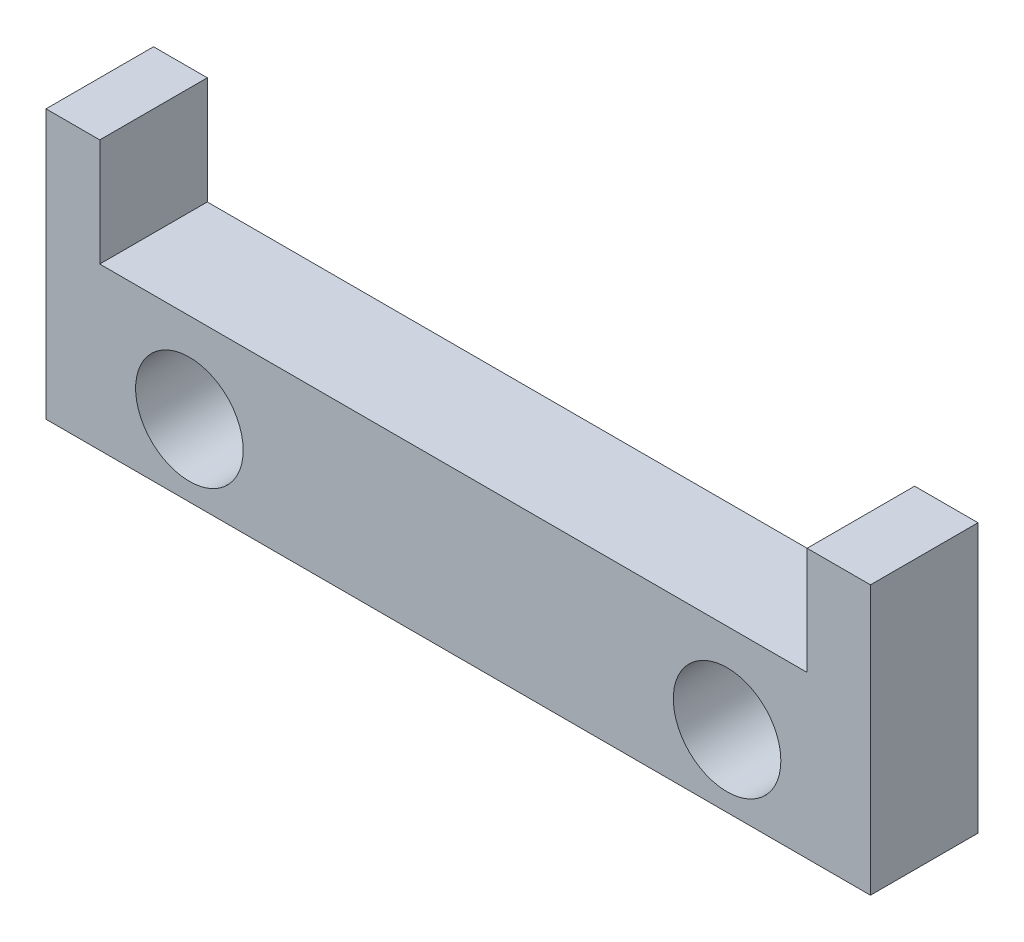
ISO-10303-21;
HEADER;
FILE_DESCRIPTION(('STEP AP214'),'2;1');
FILE_NAME('part.step','',(''),(''),'','','');
FILE_SCHEMA(('AUTOMOTIVE_DESIGN { 1 0 10303 214 1 1 1 1 }'));
ENDSEC;
DATA;
#1=APPLICATION_CONTEXT('core data for automotive mechanical design processes');
#2=APPLICATION_PROTOCOL_DEFINITION('international standard','automotive_design',2000,#1);
#3=PRODUCT_CONTEXT('',#1,'mechanical');
#4=PRODUCT('Part','Part','',(#3));
#5=PRODUCT_RELATED_PRODUCT_CATEGORY('part','',(#4));
#6=PRODUCT_DEFINITION_FORMATION('','',#4);
#7=PRODUCT_DEFINITION_CONTEXT('part definition',#1,'design');
#8=PRODUCT_DEFINITION('design','',#6,#7);
#9=PRODUCT_DEFINITION_SHAPE('','',#8);
#10=(LENGTH_UNIT() NAMED_UNIT(*) SI_UNIT(.MILLI.,.METRE.));
#11=(NAMED_UNIT(*) PLANE_ANGLE_UNIT() SI_UNIT($,.RADIAN.));
#12=(NAMED_UNIT(*) SI_UNIT($,.STERADIAN.) SOLID_ANGLE_UNIT());
#13=UNCERTAINTY_MEASURE_WITH_UNIT(LENGTH_MEASURE(1.E-05),#10,'distance_accuracy_value','');
#14=(GEOMETRIC_REPRESENTATION_CONTEXT(3) GLOBAL_UNCERTAINTY_ASSIGNED_CONTEXT((#13)) GLOBAL_UNIT_ASSIGNED_CONTEXT((#10,
#11,#12)) REPRESENTATION_CONTEXT('',''));
#15=CARTESIAN_POINT('',(0.,0.,0.));
#16=DIRECTION('',(0.,0.,1.));
#17=DIRECTION('',(1.,0.,0.));
#18=AXIS2_PLACEMENT_3D('',#15,#16,#17);
#19=CARTESIAN_POINT('',(0.,0.,6.));
#20=DIRECTION('',(0.,0.,1.));
#21=DIRECTION('',(1.,0.,0.));
#22=AXIS2_PLACEMENT_3D('',#19,#20,#21);
#23=PLANE('',#22);
#24=CARTESIAN_POINT('',(-15.,4.,6.));
#25=DIRECTION('',(0.,0.,1.));
#26=DIRECTION('',(1.,0.,0.));
#27=AXIS2_PLACEMENT_3D('',#24,#25,#26);
#28=CIRCLE('',#27,3.);
#29=CARTESIAN_POINT('',(-12.,4.,6.));
#30=VERTEX_POINT('',#29);
#31=EDGE_CURVE('E134',#30,#30,#28,.T.);
#32=ORIENTED_EDGE('',*,*,#31,.F.);
#33=EDGE_LOOP('',(#32));
#34=FACE_BOUND('',#33,.T.);
#35=DIRECTION('',(0.,-1.,0.));
#36=VECTOR('',#35,1.);
#37=CARTESIAN_POINT('',(-23.,15.,6.));
#38=LINE('',#37,#36);
#39=CARTESIAN_POINT('',(-23.,15.,6.));
#40=VERTEX_POINT('',#39);
#41=CARTESIAN_POINT('',(-23.,0.,6.));
#42=VERTEX_POINT('',#41);
#43=EDGE_CURVE('E145',#40,#42,#38,.T.);
#44=ORIENTED_EDGE('',*,*,#43,.T.);
#45=DIRECTION('',(1.,0.,0.));
#46=VECTOR('',#45,1.);
#47=CARTESIAN_POINT('',(-23.,0.,6.));
#48=LINE('',#47,#46);
#49=CARTESIAN_POINT('',(23.,0.,6.));
#50=VERTEX_POINT('',#49);
#51=EDGE_CURVE('E93',#42,#50,#48,.T.);
#52=ORIENTED_EDGE('',*,*,#51,.T.);
#53=DIRECTION('',(0.,1.,0.));
#54=VECTOR('',#53,1.);
#55=CARTESIAN_POINT('',(23.,0.,6.));
#56=LINE('',#55,#54);
#57=CARTESIAN_POINT('',(23.,15.,6.));
#58=VERTEX_POINT('',#57);
#59=EDGE_CURVE('E160',#50,#58,#56,.T.);
#60=ORIENTED_EDGE('',*,*,#59,.T.);
#61=DIRECTION('',(-1.,0.,0.));
#62=VECTOR('',#61,1.);
#63=CARTESIAN_POINT('',(19.4646030716631,15.,6.));
#64=LINE('',#63,#62);
#65=CARTESIAN_POINT('',(19.4646030716631,15.,6.));
#66=VERTEX_POINT('',#65);
#67=EDGE_CURVE('E173',#58,#66,#64,.T.);
#68=ORIENTED_EDGE('',*,*,#67,.T.);
#69=DIRECTION('',(0.,-1.,0.));
#70=VECTOR('',#69,1.);
#71=CARTESIAN_POINT('',(19.4646030716631,9.,6.));
#72=LINE('',#71,#70);
#73=CARTESIAN_POINT('',(19.4646030716631,9.,6.));
#74=VERTEX_POINT('',#73);
#75=EDGE_CURVE('E112',#66,#74,#72,.T.);
#76=ORIENTED_EDGE('',*,*,#75,.T.);
#77=DIRECTION('',(-1.,0.,0.));
#78=VECTOR('',#77,1.);
#79=CARTESIAN_POINT('',(-20.,9.,6.));
#80=LINE('',#79,#78);
#81=CARTESIAN_POINT('',(-20.,9.,6.));
#82=VERTEX_POINT('',#81);
#83=EDGE_CURVE('E106',#74,#82,#80,.T.);
#84=ORIENTED_EDGE('',*,*,#83,.T.);
#85=DIRECTION('',(0.,1.,0.));
#86=VECTOR('',#85,1.);
#87=CARTESIAN_POINT('',(-20.,15.,6.));
#88=LINE('',#87,#86);
#89=CARTESIAN_POINT('',(-20.,15.,6.));
#90=VERTEX_POINT('',#89);
#91=EDGE_CURVE('E110',#82,#90,#88,.T.);
#92=ORIENTED_EDGE('',*,*,#91,.T.);
#93=DIRECTION('',(-1.,0.,0.));
#94=VECTOR('',#93,1.);
#95=CARTESIAN_POINT('',(-23.,15.,6.));
#96=LINE('',#95,#94);
#97=EDGE_CURVE('E50',#90,#40,#96,.T.);
#98=ORIENTED_EDGE('',*,*,#97,.T.);
#99=EDGE_LOOP('',(#44,#52,#60,#68,#76,#84,#92,#98));
#100=FACE_BOUND('',#99,.T.);
#101=CARTESIAN_POINT('',(15.,4.,6.));
#102=DIRECTION('',(0.,0.,1.));
#103=DIRECTION('',(1.,0.,0.));
#104=AXIS2_PLACEMENT_3D('',#101,#102,#103);
#105=CIRCLE('',#104,3.);
#106=CARTESIAN_POINT('',(18.,4.,6.));
#107=VERTEX_POINT('',#106);
#108=EDGE_CURVE('E182',#107,#107,#105,.T.);
#109=ORIENTED_EDGE('',*,*,#108,.F.);
#110=EDGE_LOOP('',(#109));
#111=FACE_BOUND('',#110,.T.);
#112=ADVANCED_FACE('F33',(#34,#100,#111),#23,.T.);
#113=CARTESIAN_POINT('',(0.,0.,0.));
#114=DIRECTION('',(0.,0.,1.));
#115=DIRECTION('',(1.,0.,0.));
#116=AXIS2_PLACEMENT_3D('',#113,#114,#115);
#117=PLANE('',#116);
#118=DIRECTION('',(0.,-1.,0.));
#119=VECTOR('',#118,1.);
#120=CARTESIAN_POINT('',(-23.,15.,0.));
#121=LINE('',#120,#119);
#122=CARTESIAN_POINT('',(-23.,15.,0.));
#123=VERTEX_POINT('',#122);
#124=CARTESIAN_POINT('',(-23.,0.,0.));
#125=VERTEX_POINT('',#124);
#126=EDGE_CURVE('E130',#123,#125,#121,.T.);
#127=ORIENTED_EDGE('',*,*,#126,.F.);
#128=DIRECTION('',(-1.,0.,0.));
#129=VECTOR('',#128,1.);
#130=CARTESIAN_POINT('',(-23.,15.,0.));
#131=LINE('',#130,#129);
#132=CARTESIAN_POINT('',(-20.,15.,0.));
#133=VERTEX_POINT('',#132);
#134=EDGE_CURVE('E85',#133,#123,#131,.T.);
#135=ORIENTED_EDGE('',*,*,#134,.F.);
#136=DIRECTION('',(0.,1.,0.));
#137=VECTOR('',#136,1.);
#138=CARTESIAN_POINT('',(-20.,15.,0.));
#139=LINE('',#138,#137);
#140=CARTESIAN_POINT('',(-20.,9.,0.));
#141=VERTEX_POINT('',#140);
#142=EDGE_CURVE('E79',#141,#133,#139,.T.);
#143=ORIENTED_EDGE('',*,*,#142,.F.);
#144=DIRECTION('',(-1.,0.,0.));
#145=VECTOR('',#144,1.);
#146=CARTESIAN_POINT('',(-20.,9.,0.));
#147=LINE('',#146,#145);
#148=CARTESIAN_POINT('',(19.4646030716631,9.,0.));
#149=VERTEX_POINT('',#148);
#150=EDGE_CURVE('E120',#149,#141,#147,.T.);
#151=ORIENTED_EDGE('',*,*,#150,.F.);
#152=DIRECTION('',(0.,-1.,0.));
#153=VECTOR('',#152,1.);
#154=CARTESIAN_POINT('',(19.4646030716631,9.,0.));
#155=LINE('',#154,#153);
#156=CARTESIAN_POINT('',(19.4646030716631,15.,0.));
#157=VERTEX_POINT('',#156);
#158=EDGE_CURVE('E140',#157,#149,#155,.T.);
#159=ORIENTED_EDGE('',*,*,#158,.F.);
#160=DIRECTION('',(-1.,0.,0.));
#161=VECTOR('',#160,1.);
#162=CARTESIAN_POINT('',(19.4646030716631,15.,0.));
#163=LINE('',#162,#161);
#164=CARTESIAN_POINT('',(23.,15.,0.));
#165=VERTEX_POINT('',#164);
#166=EDGE_CURVE('E138',#165,#157,#163,.T.);
#167=ORIENTED_EDGE('',*,*,#166,.F.);
#168=DIRECTION('',(0.,1.,0.));
#169=VECTOR('',#168,1.);
#170=CARTESIAN_POINT('',(23.,0.,0.));
#171=LINE('',#170,#169);
#172=CARTESIAN_POINT('',(23.,0.,0.));
#173=VERTEX_POINT('',#172);
#174=EDGE_CURVE('E136',#173,#165,#171,.T.);
#175=ORIENTED_EDGE('',*,*,#174,.F.);
#176=DIRECTION('',(1.,0.,0.));
#177=VECTOR('',#176,1.);
#178=CARTESIAN_POINT('',(-23.,0.,0.));
#179=LINE('',#178,#177);
#180=EDGE_CURVE('E133',#125,#173,#179,.T.);
#181=ORIENTED_EDGE('',*,*,#180,.F.);
#182=EDGE_LOOP('',(#127,#135,#143,#151,#159,#167,#175,#181));
#183=FACE_BOUND('',#182,.T.);
#184=CARTESIAN_POINT('',(-15.,4.,0.));
#185=DIRECTION('',(0.,0.,1.));
#186=DIRECTION('',(1.,0.,0.));
#187=AXIS2_PLACEMENT_3D('',#184,#185,#186);
#188=CIRCLE('',#187,3.);
#189=CARTESIAN_POINT('',(-12.,4.,0.));
#190=VERTEX_POINT('',#189);
#191=EDGE_CURVE('E179',#190,#190,#188,.T.);
#192=ORIENTED_EDGE('',*,*,#191,.T.);
#193=EDGE_LOOP('',(#192));
#194=FACE_BOUND('',#193,.T.);
#195=CARTESIAN_POINT('',(15.,4.,0.));
#196=DIRECTION('',(0.,0.,1.));
#197=DIRECTION('',(1.,0.,0.));
#198=AXIS2_PLACEMENT_3D('',#195,#196,#197);
#199=CIRCLE('',#198,3.);
#200=CARTESIAN_POINT('',(18.,4.,0.));
#201=VERTEX_POINT('',#200);
#202=EDGE_CURVE('E185',#201,#201,#199,.T.);
#203=ORIENTED_EDGE('',*,*,#202,.T.);
#204=EDGE_LOOP('',(#203));
#205=FACE_BOUND('',#204,.T.);
#206=ADVANCED_FACE('F164',(#183,#194,#205),#117,.F.);
#207=CARTESIAN_POINT('',(-23.,15.,6.));
#208=DIRECTION('',(1.,0.,0.));
#209=DIRECTION('',(0.,0.,-1.));
#210=AXIS2_PLACEMENT_3D('',#207,#208,#209);
#211=PLANE('',#210);
#212=ORIENTED_EDGE('',*,*,#126,.T.);
#213=DIRECTION('',(0.,0.,-1.));
#214=VECTOR('',#213,1.);
#215=CARTESIAN_POINT('',(-23.,0.,6.));
#216=LINE('',#215,#214);
#217=EDGE_CURVE('E11',#42,#125,#216,.T.);
#218=ORIENTED_EDGE('',*,*,#217,.F.);
#219=ORIENTED_EDGE('',*,*,#43,.F.);
#220=DIRECTION('',(0.,0.,-1.));
#221=VECTOR('',#220,1.);
#222=CARTESIAN_POINT('',(-23.,15.,6.));
#223=LINE('',#222,#221);
#224=EDGE_CURVE('E126',#40,#123,#223,.T.);
#225=ORIENTED_EDGE('',*,*,#224,.T.);
#226=EDGE_LOOP('',(#212,#218,#219,#225));
#227=FACE_BOUND('',#226,.T.);
#228=ADVANCED_FACE('F35',(#227),#211,.F.);
#229=CARTESIAN_POINT('',(-23.,0.,6.));
#230=DIRECTION('',(0.,1.,0.));
#231=DIRECTION('',(-1.,0.,0.));
#232=AXIS2_PLACEMENT_3D('',#229,#230,#231);
#233=PLANE('',#232);
#234=ORIENTED_EDGE('',*,*,#180,.T.);
#235=DIRECTION('',(0.,0.,-1.));
#236=VECTOR('',#235,1.);
#237=CARTESIAN_POINT('',(23.,0.,6.));
#238=LINE('',#237,#236);
#239=EDGE_CURVE('E42',#50,#173,#238,.T.);
#240=ORIENTED_EDGE('',*,*,#239,.F.);
#241=ORIENTED_EDGE('',*,*,#51,.F.);
#242=ORIENTED_EDGE('',*,*,#217,.T.);
#243=EDGE_LOOP('',(#234,#240,#241,#242));
#244=FACE_BOUND('',#243,.T.);
#245=ADVANCED_FACE('F217',(#244),#233,.F.);
#246=CARTESIAN_POINT('',(23.,0.,6.));
#247=DIRECTION('',(-1.,0.,0.));
#248=DIRECTION('',(0.,0.,1.));
#249=AXIS2_PLACEMENT_3D('',#246,#247,#248);
#250=PLANE('',#249);
#251=ORIENTED_EDGE('',*,*,#174,.T.);
#252=DIRECTION('',(0.,0.,-1.));
#253=VECTOR('',#252,1.);
#254=CARTESIAN_POINT('',(23.,15.,6.));
#255=LINE('',#254,#253);
#256=EDGE_CURVE('E152',#58,#165,#255,.T.);
#257=ORIENTED_EDGE('',*,*,#256,.F.);
#258=ORIENTED_EDGE('',*,*,#59,.F.);
#259=ORIENTED_EDGE('',*,*,#239,.T.);
#260=EDGE_LOOP('',(#251,#257,#258,#259));
#261=FACE_BOUND('',#260,.T.);
#262=ADVANCED_FACE('F158',(#261),#250,.F.);
#263=CARTESIAN_POINT('',(19.4646030716631,15.,6.));
#264=DIRECTION('',(0.,-1.,0.));
#265=DIRECTION('',(0.,0.,-1.));
#266=AXIS2_PLACEMENT_3D('',#263,#264,#265);
#267=PLANE('',#266);
#268=ORIENTED_EDGE('',*,*,#166,.T.);
#269=DIRECTION('',(0.,0.,-1.));
#270=VECTOR('',#269,1.);
#271=CARTESIAN_POINT('',(19.4646030716631,15.,6.));
#272=LINE('',#271,#270);
#273=EDGE_CURVE('E149',#66,#157,#272,.T.);
#274=ORIENTED_EDGE('',*,*,#273,.F.);
#275=ORIENTED_EDGE('',*,*,#67,.F.);
#276=ORIENTED_EDGE('',*,*,#256,.T.);
#277=EDGE_LOOP('',(#268,#274,#275,#276));
#278=FACE_BOUND('',#277,.T.);
#279=ADVANCED_FACE('F169',(#278),#267,.F.);
#280=CARTESIAN_POINT('',(19.4646030716631,9.,6.));
#281=DIRECTION('',(1.,0.,0.));
#282=DIRECTION('',(0.,0.,-1.));
#283=AXIS2_PLACEMENT_3D('',#280,#281,#282);
#284=PLANE('',#283);
#285=ORIENTED_EDGE('',*,*,#158,.T.);
#286=DIRECTION('',(0.,0.,-1.));
#287=VECTOR('',#286,1.);
#288=CARTESIAN_POINT('',(19.4646030716631,9.,6.));
#289=LINE('',#288,#287);
#290=EDGE_CURVE('E121',#74,#149,#289,.T.);
#291=ORIENTED_EDGE('',*,*,#290,.F.);
#292=ORIENTED_EDGE('',*,*,#75,.F.);
#293=ORIENTED_EDGE('',*,*,#273,.T.);
#294=EDGE_LOOP('',(#285,#291,#292,#293));
#295=FACE_BOUND('',#294,.T.);
#296=ADVANCED_FACE('F172',(#295),#284,.F.);
#297=CARTESIAN_POINT('',(-20.,9.,6.));
#298=DIRECTION('',(0.,-1.,0.));
#299=DIRECTION('',(0.,0.,-1.));
#300=AXIS2_PLACEMENT_3D('',#297,#298,#299);
#301=PLANE('',#300);
#302=ORIENTED_EDGE('',*,*,#150,.T.);
#303=DIRECTION('',(0.,0.,-1.));
#304=VECTOR('',#303,1.);
#305=CARTESIAN_POINT('',(-20.,9.,6.));
#306=LINE('',#305,#304);
#307=EDGE_CURVE('E117',#82,#141,#306,.T.);
#308=ORIENTED_EDGE('',*,*,#307,.F.);
#309=ORIENTED_EDGE('',*,*,#83,.F.);
#310=ORIENTED_EDGE('',*,*,#290,.T.);
#311=EDGE_LOOP('',(#302,#308,#309,#310));
#312=FACE_BOUND('',#311,.T.);
#313=ADVANCED_FACE('F118',(#312),#301,.F.);
#314=CARTESIAN_POINT('',(-20.,15.,6.));
#315=DIRECTION('',(-1.,0.,0.));
#316=DIRECTION('',(0.,0.,1.));
#317=AXIS2_PLACEMENT_3D('',#314,#315,#316);
#318=PLANE('',#317);
#319=ORIENTED_EDGE('',*,*,#142,.T.);
#320=DIRECTION('',(0.,0.,-1.));
#321=VECTOR('',#320,1.);
#322=CARTESIAN_POINT('',(-20.,15.,6.));
#323=LINE('',#322,#321);
#324=EDGE_CURVE('E122',#90,#133,#323,.T.);
#325=ORIENTED_EDGE('',*,*,#324,.F.);
#326=ORIENTED_EDGE('',*,*,#91,.F.);
#327=ORIENTED_EDGE('',*,*,#307,.T.);
#328=EDGE_LOOP('',(#319,#325,#326,#327));
#329=FACE_BOUND('',#328,.T.);
#330=ADVANCED_FACE('F124',(#329),#318,.F.);
#331=CARTESIAN_POINT('',(-23.,15.,6.));
#332=DIRECTION('',(0.,-1.,0.));
#333=DIRECTION('',(0.,0.,-1.));
#334=AXIS2_PLACEMENT_3D('',#331,#332,#333);
#335=PLANE('',#334);
#336=ORIENTED_EDGE('',*,*,#134,.T.);
#337=ORIENTED_EDGE('',*,*,#224,.F.);
#338=ORIENTED_EDGE('',*,*,#97,.F.);
#339=ORIENTED_EDGE('',*,*,#324,.T.);
#340=EDGE_LOOP('',(#336,#337,#338,#339));
#341=FACE_BOUND('',#340,.T.);
#342=ADVANCED_FACE('F205',(#341),#335,.F.);
#343=CARTESIAN_POINT('',(-15.,4.,6.));
#344=DIRECTION('',(0.,0.,-1.));
#345=DIRECTION('',(-1.,0.,0.));
#346=AXIS2_PLACEMENT_3D('',#343,#344,#345);
#347=CYLINDRICAL_SURFACE('',#346,3.);
#348=ORIENTED_EDGE('',*,*,#31,.T.);
#349=EDGE_LOOP('',(#348));
#350=FACE_BOUND('',#349,.T.);
#351=ORIENTED_EDGE('',*,*,#191,.F.);
#352=EDGE_LOOP('',(#351));
#353=FACE_BOUND('',#352,.T.);
#354=ADVANCED_FACE('F202',(#350,#353),#347,.F.);
#355=CARTESIAN_POINT('',(15.,4.,6.));
#356=DIRECTION('',(0.,0.,-1.));
#357=DIRECTION('',(-1.,0.,0.));
#358=AXIS2_PLACEMENT_3D('',#355,#356,#357);
#359=CYLINDRICAL_SURFACE('',#358,3.);
#360=ORIENTED_EDGE('',*,*,#108,.T.);
#361=EDGE_LOOP('',(#360));
#362=FACE_BOUND('',#361,.T.);
#363=ORIENTED_EDGE('',*,*,#202,.F.);
#364=EDGE_LOOP('',(#363));
#365=FACE_BOUND('',#364,.T.);
#366=ADVANCED_FACE('F191',(#362,#365),#359,.F.);
#367=CLOSED_SHELL('',(#112,#206,#228,#245,#262,#279,#296,#313,#330,#342,#354,#366));
#368=MANIFOLD_SOLID_BREP('B2',#367);
#369=ADVANCED_BREP_SHAPE_REPRESENTATION('',(#18,#368),#14);
#370=SHAPE_DEFINITION_REPRESENTATION(#9,#369);
ENDSEC;
END-ISO-10303-21;
